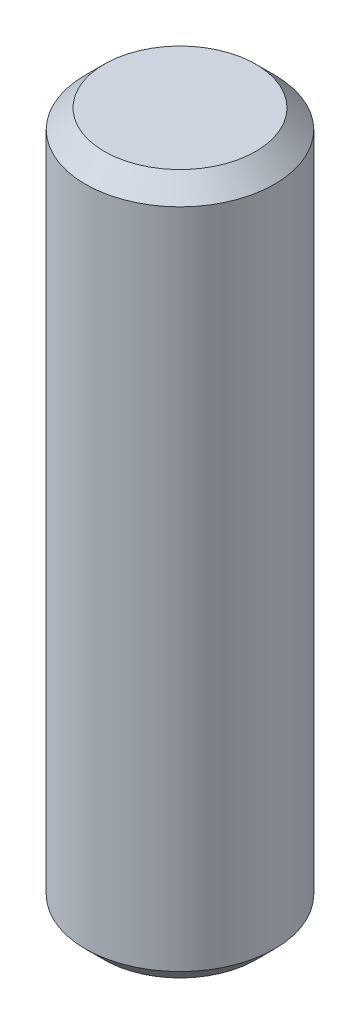
ISO-10303-21;
HEADER;
FILE_DESCRIPTION(('STEP AP214'),'2;1');
FILE_NAME('part.step','',(''),(''),'','','');
FILE_SCHEMA(('AUTOMOTIVE_DESIGN { 1 0 10303 214 1 1 1 1 }'));
ENDSEC;
DATA;
#1=APPLICATION_CONTEXT('core data for automotive mechanical design processes');
#2=APPLICATION_PROTOCOL_DEFINITION('international standard','automotive_design',2000,#1);
#3=PRODUCT_CONTEXT('',#1,'mechanical');
#4=PRODUCT('Part','Part','',(#3));
#5=PRODUCT_RELATED_PRODUCT_CATEGORY('part','',(#4));
#6=PRODUCT_DEFINITION_FORMATION('','',#4);
#7=PRODUCT_DEFINITION_CONTEXT('part definition',#1,'design');
#8=PRODUCT_DEFINITION('design','',#6,#7);
#9=PRODUCT_DEFINITION_SHAPE('','',#8);
#10=(LENGTH_UNIT() NAMED_UNIT(*) SI_UNIT(.MILLI.,.METRE.));
#11=(NAMED_UNIT(*) PLANE_ANGLE_UNIT() SI_UNIT($,.RADIAN.));
#12=(NAMED_UNIT(*) SI_UNIT($,.STERADIAN.) SOLID_ANGLE_UNIT());
#13=UNCERTAINTY_MEASURE_WITH_UNIT(LENGTH_MEASURE(1.E-05),#10,'distance_accuracy_value','');
#14=(GEOMETRIC_REPRESENTATION_CONTEXT(3) GLOBAL_UNCERTAINTY_ASSIGNED_CONTEXT((#13)) GLOBAL_UNIT_ASSIGNED_CONTEXT((#10,
#11,#12)) REPRESENTATION_CONTEXT('',''));
#15=CARTESIAN_POINT('',(0.,0.,0.));
#16=DIRECTION('',(0.,0.,1.));
#17=DIRECTION('',(1.,0.,0.));
#18=AXIS2_PLACEMENT_3D('',#15,#16,#17);
#19=CARTESIAN_POINT('',(0.,74.,0.));
#20=DIRECTION('',(0.,1.,0.));
#21=DIRECTION('',(0.,0.,1.));
#22=AXIS2_PLACEMENT_3D('',#19,#20,#21);
#23=PLANE('',#22);
#24=CARTESIAN_POINT('',(0.,74.,0.));
#25=DIRECTION('',(0.,1.,0.));
#26=DIRECTION('',(0.,0.,1.));
#27=AXIS2_PLACEMENT_3D('',#24,#25,#26);
#28=CIRCLE('',#27,7.99999999999999);
#29=CARTESIAN_POINT('',(0.,74.,7.99999999999999));
#30=VERTEX_POINT('',#29);
#31=EDGE_CURVE('E10',#30,#30,#28,.T.);
#32=ORIENTED_EDGE('',*,*,#31,.T.);
#33=EDGE_LOOP('',(#32));
#34=FACE_BOUND('',#33,.T.);
#35=ADVANCED_FACE('F34',(#34),#23,.T.);
#36=CARTESIAN_POINT('',(0.,0.,0.));
#37=DIRECTION('',(0.,-1.,0.));
#38=DIRECTION('',(0.,0.,-1.));
#39=AXIS2_PLACEMENT_3D('',#36,#37,#38);
#40=CYLINDRICAL_SURFACE('',#39,10.);
#41=CARTESIAN_POINT('',(0.,2.00000000000001,0.));
#42=DIRECTION('',(0.,-1.,0.));
#43=DIRECTION('',(0.,0.,-1.));
#44=AXIS2_PLACEMENT_3D('',#41,#42,#43);
#45=CIRCLE('',#44,10.);
#46=CARTESIAN_POINT('',(0.,2.00000000000001,-10.));
#47=VERTEX_POINT('',#46);
#48=EDGE_CURVE('E41',#47,#47,#45,.F.);
#49=ORIENTED_EDGE('',*,*,#48,.T.);
#50=EDGE_LOOP('',(#49));
#51=FACE_BOUND('',#50,.T.);
#52=CARTESIAN_POINT('',(0.,72.,0.));
#53=DIRECTION('',(0.,1.,0.));
#54=DIRECTION('',(0.,0.,1.));
#55=AXIS2_PLACEMENT_3D('',#52,#53,#54);
#56=CIRCLE('',#55,10.);
#57=CARTESIAN_POINT('',(0.,72.,10.));
#58=VERTEX_POINT('',#57);
#59=EDGE_CURVE('E45',#58,#58,#56,.F.);
#60=ORIENTED_EDGE('',*,*,#59,.T.);
#61=EDGE_LOOP('',(#60));
#62=FACE_BOUND('',#61,.T.);
#63=ADVANCED_FACE('F65',(#51,#62),#40,.T.);
#64=CARTESIAN_POINT('',(0.,0.,0.));
#65=DIRECTION('',(0.,-1.,0.));
#66=DIRECTION('',(0.,0.,-1.));
#67=AXIS2_PLACEMENT_3D('',#64,#65,#66);
#68=PLANE('',#67);
#69=CARTESIAN_POINT('',(0.,0.,0.));
#70=DIRECTION('',(0.,-1.,0.));
#71=DIRECTION('',(0.,0.,-1.));
#72=AXIS2_PLACEMENT_3D('',#69,#70,#71);
#73=CIRCLE('',#72,7.99999999999999);
#74=CARTESIAN_POINT('',(0.,0.,-7.99999999999999));
#75=VERTEX_POINT('',#74);
#76=EDGE_CURVE('E49',#75,#75,#73,.T.);
#77=ORIENTED_EDGE('',*,*,#76,.T.);
#78=EDGE_LOOP('',(#77));
#79=FACE_BOUND('',#78,.T.);
#80=ADVANCED_FACE('F55',(#79),#68,.T.);
#81=CARTESIAN_POINT('',(0.,0.,0.));
#82=DIRECTION('',(0.,1.,0.));
#83=DIRECTION('',(0.,0.,1.));
#84=AXIS2_PLACEMENT_3D('',#81,#82,#83);
#85=CONICAL_SURFACE('',#84,7.99999999999999,0.785398163397448);
#86=ORIENTED_EDGE('',*,*,#48,.F.);
#87=EDGE_LOOP('',(#86));
#88=FACE_BOUND('',#87,.T.);
#89=ORIENTED_EDGE('',*,*,#76,.F.);
#90=EDGE_LOOP('',(#89));
#91=FACE_BOUND('',#90,.T.);
#92=ADVANCED_FACE('F57',(#88,#91),#85,.T.);
#93=CARTESIAN_POINT('',(0.,72.,0.));
#94=DIRECTION('',(0.,-1.,0.));
#95=DIRECTION('',(0.,0.,-1.));
#96=AXIS2_PLACEMENT_3D('',#93,#94,#95);
#97=CONICAL_SURFACE('',#96,10.,0.785398163397453);
#98=ORIENTED_EDGE('',*,*,#31,.F.);
#99=EDGE_LOOP('',(#98));
#100=FACE_BOUND('',#99,.T.);
#101=ORIENTED_EDGE('',*,*,#59,.F.);
#102=EDGE_LOOP('',(#101));
#103=FACE_BOUND('',#102,.T.);
#104=ADVANCED_FACE('F36',(#100,#103),#97,.T.);
#105=CLOSED_SHELL('',(#35,#63,#80,#92,#104));
#106=MANIFOLD_SOLID_BREP('B2',#105);
#107=ADVANCED_BREP_SHAPE_REPRESENTATION('',(#18,#106),#14);
#108=SHAPE_DEFINITION_REPRESENTATION(#9,#107);
ENDSEC;
END-ISO-10303-21;
